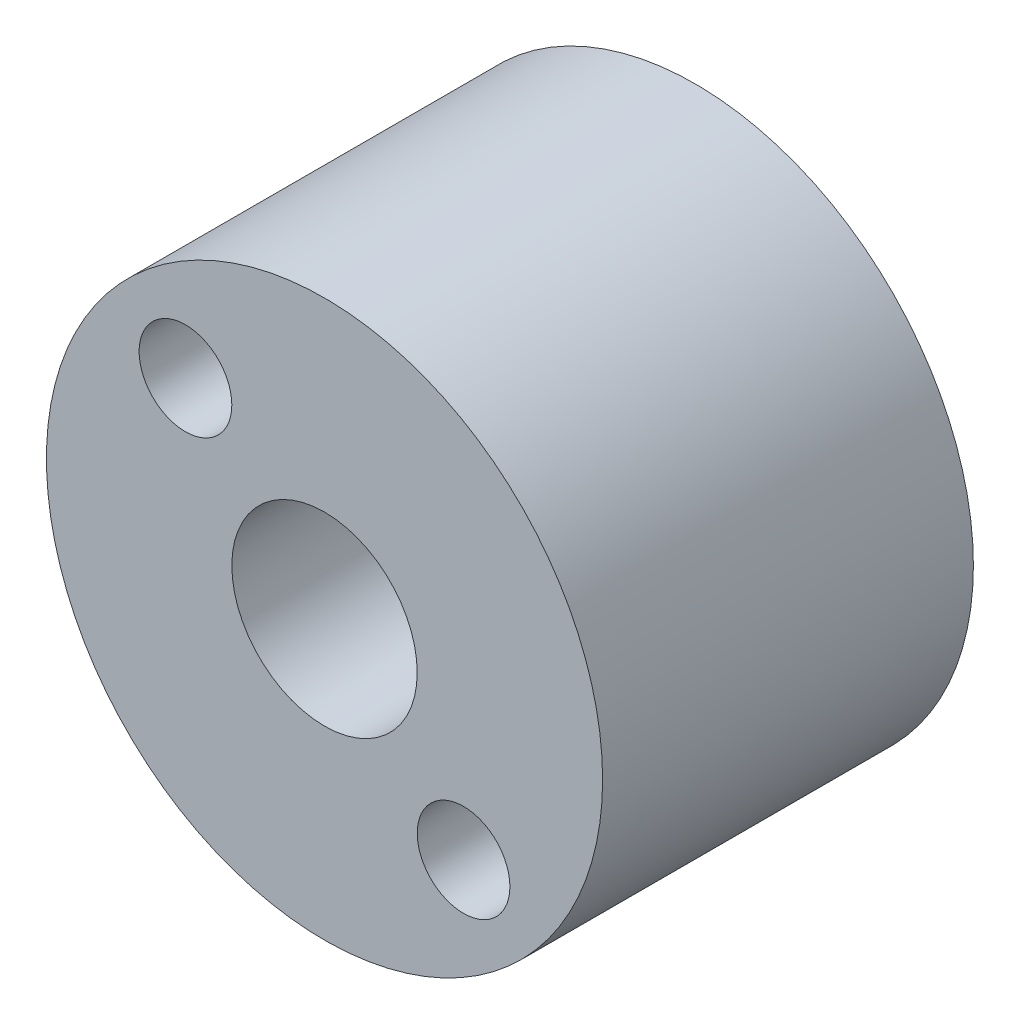
ISO-10303-21;
HEADER;
FILE_DESCRIPTION(('STEP AP214'),'2;1');
FILE_NAME('part.step','',(''),(''),'','','');
FILE_SCHEMA(('AUTOMOTIVE_DESIGN { 1 0 10303 214 1 1 1 1 }'));
ENDSEC;
DATA;
#1=APPLICATION_CONTEXT('core data for automotive mechanical design processes');
#2=APPLICATION_PROTOCOL_DEFINITION('international standard','automotive_design',2000,#1);
#3=PRODUCT_CONTEXT('',#1,'mechanical');
#4=PRODUCT('Part','Part','',(#3));
#5=PRODUCT_RELATED_PRODUCT_CATEGORY('part','',(#4));
#6=PRODUCT_DEFINITION_FORMATION('','',#4);
#7=PRODUCT_DEFINITION_CONTEXT('part definition',#1,'design');
#8=PRODUCT_DEFINITION('design','',#6,#7);
#9=PRODUCT_DEFINITION_SHAPE('','',#8);
#10=(LENGTH_UNIT() NAMED_UNIT(*) SI_UNIT(.MILLI.,.METRE.));
#11=(NAMED_UNIT(*) PLANE_ANGLE_UNIT() SI_UNIT($,.RADIAN.));
#12=(NAMED_UNIT(*) SI_UNIT($,.STERADIAN.) SOLID_ANGLE_UNIT());
#13=UNCERTAINTY_MEASURE_WITH_UNIT(LENGTH_MEASURE(1.E-05),#10,'distance_accuracy_value','');
#14=(GEOMETRIC_REPRESENTATION_CONTEXT(3) GLOBAL_UNCERTAINTY_ASSIGNED_CONTEXT((#13)) GLOBAL_UNIT_ASSIGNED_CONTEXT((#10,
#11,#12)) REPRESENTATION_CONTEXT('',''));
#15=CARTESIAN_POINT('',(0.,0.,0.));
#16=DIRECTION('',(0.,0.,1.));
#17=DIRECTION('',(1.,0.,0.));
#18=AXIS2_PLACEMENT_3D('',#15,#16,#17);
#19=CARTESIAN_POINT('',(0.,0.,20.));
#20=DIRECTION('',(0.,0.,-1.));
#21=DIRECTION('',(-1.,0.,0.));
#22=AXIS2_PLACEMENT_3D('',#19,#20,#21);
#23=CYLINDRICAL_SURFACE('',#22,15.);
#24=CARTESIAN_POINT('',(0.,0.,20.));
#25=DIRECTION('',(0.,0.,1.));
#26=DIRECTION('',(1.,0.,0.));
#27=AXIS2_PLACEMENT_3D('',#24,#25,#26);
#28=CIRCLE('',#27,15.);
#29=CARTESIAN_POINT('',(15.,0.,20.));
#30=VERTEX_POINT('',#29);
#31=EDGE_CURVE('E10',#30,#30,#28,.T.);
#32=ORIENTED_EDGE('',*,*,#31,.F.);
#33=EDGE_LOOP('',(#32));
#34=FACE_BOUND('',#33,.T.);
#35=CARTESIAN_POINT('',(0.,0.,0.));
#36=DIRECTION('',(0.,0.,1.));
#37=DIRECTION('',(1.,0.,0.));
#38=AXIS2_PLACEMENT_3D('',#35,#36,#37);
#39=CIRCLE('',#38,15.);
#40=CARTESIAN_POINT('',(15.,0.,0.));
#41=VERTEX_POINT('',#40);
#42=EDGE_CURVE('E34',#41,#41,#39,.T.);
#43=ORIENTED_EDGE('',*,*,#42,.T.);
#44=EDGE_LOOP('',(#43));
#45=FACE_BOUND('',#44,.T.);
#46=ADVANCED_FACE('F31',(#34,#45),#23,.T.);
#47=CARTESIAN_POINT('',(0.,0.,20.));
#48=DIRECTION('',(0.,0.,1.));
#49=DIRECTION('',(1.,0.,0.));
#50=AXIS2_PLACEMENT_3D('',#47,#48,#49);
#51=PLANE('',#50);
#52=CARTESIAN_POINT('',(-7.5,7.5,20.));
#53=DIRECTION('',(0.,0.,1.));
#54=DIRECTION('',(1.,0.,0.));
#55=AXIS2_PLACEMENT_3D('',#52,#53,#54);
#56=CIRCLE('',#55,2.5);
#57=CARTESIAN_POINT('',(-5.,7.5,20.));
#58=VERTEX_POINT('',#57);
#59=EDGE_CURVE('E57',#58,#58,#56,.T.);
#60=ORIENTED_EDGE('',*,*,#59,.F.);
#61=EDGE_LOOP('',(#60));
#62=FACE_BOUND('',#61,.T.);
#63=CARTESIAN_POINT('',(7.5,-7.5,20.));
#64=DIRECTION('',(0.,0.,1.));
#65=DIRECTION('',(1.,0.,0.));
#66=AXIS2_PLACEMENT_3D('',#63,#64,#65);
#67=CIRCLE('',#66,2.5);
#68=CARTESIAN_POINT('',(10.,-7.5,20.));
#69=VERTEX_POINT('',#68);
#70=EDGE_CURVE('E51',#69,#69,#67,.T.);
#71=ORIENTED_EDGE('',*,*,#70,.F.);
#72=EDGE_LOOP('',(#71));
#73=FACE_BOUND('',#72,.T.);
#74=CARTESIAN_POINT('',(0.,0.,20.));
#75=DIRECTION('',(0.,0.,1.));
#76=DIRECTION('',(1.,0.,0.));
#77=AXIS2_PLACEMENT_3D('',#74,#75,#76);
#78=CIRCLE('',#77,5.);
#79=CARTESIAN_POINT('',(5.,0.,20.));
#80=VERTEX_POINT('',#79);
#81=EDGE_CURVE('E45',#80,#80,#78,.T.);
#82=ORIENTED_EDGE('',*,*,#81,.F.);
#83=EDGE_LOOP('',(#82));
#84=FACE_BOUND('',#83,.T.);
#85=ORIENTED_EDGE('',*,*,#31,.T.);
#86=EDGE_LOOP('',(#85));
#87=FACE_BOUND('',#86,.T.);
#88=ADVANCED_FACE('F63',(#62,#73,#84,#87),#51,.T.);
#89=CARTESIAN_POINT('',(0.,0.,0.));
#90=DIRECTION('',(0.,0.,1.));
#91=DIRECTION('',(1.,0.,0.));
#92=AXIS2_PLACEMENT_3D('',#89,#90,#91);
#93=PLANE('',#92);
#94=CARTESIAN_POINT('',(-7.5,7.5,0.));
#95=DIRECTION('',(0.,0.,1.));
#96=DIRECTION('',(1.,0.,0.));
#97=AXIS2_PLACEMENT_3D('',#94,#95,#96);
#98=CIRCLE('',#97,2.49999999999999);
#99=CARTESIAN_POINT('',(-5.00000000000001,7.5,0.));
#100=VERTEX_POINT('',#99);
#101=EDGE_CURVE('E54',#100,#100,#98,.T.);
#102=ORIENTED_EDGE('',*,*,#101,.T.);
#103=EDGE_LOOP('',(#102));
#104=FACE_BOUND('',#103,.T.);
#105=CARTESIAN_POINT('',(7.5,-7.5,0.));
#106=DIRECTION('',(0.,0.,1.));
#107=DIRECTION('',(1.,0.,0.));
#108=AXIS2_PLACEMENT_3D('',#105,#106,#107);
#109=CIRCLE('',#108,2.49999999999999);
#110=CARTESIAN_POINT('',(9.99999999999999,-7.5,0.));
#111=VERTEX_POINT('',#110);
#112=EDGE_CURVE('E48',#111,#111,#109,.T.);
#113=ORIENTED_EDGE('',*,*,#112,.T.);
#114=EDGE_LOOP('',(#113));
#115=FACE_BOUND('',#114,.T.);
#116=CARTESIAN_POINT('',(0.,0.,0.));
#117=DIRECTION('',(0.,0.,1.));
#118=DIRECTION('',(1.,0.,0.));
#119=AXIS2_PLACEMENT_3D('',#116,#117,#118);
#120=CIRCLE('',#119,4.99999999999999);
#121=CARTESIAN_POINT('',(4.99999999999999,0.,0.));
#122=VERTEX_POINT('',#121);
#123=EDGE_CURVE('E41',#122,#122,#120,.T.);
#124=ORIENTED_EDGE('',*,*,#123,.T.);
#125=EDGE_LOOP('',(#124));
#126=FACE_BOUND('',#125,.T.);
#127=ORIENTED_EDGE('',*,*,#42,.F.);
#128=EDGE_LOOP('',(#127));
#129=FACE_BOUND('',#128,.T.);
#130=ADVANCED_FACE('F66',(#104,#115,#126,#129),#93,.F.);
#131=CARTESIAN_POINT('',(0.,0.,20.));
#132=DIRECTION('',(0.,0.,1.));
#133=DIRECTION('',(1.,0.,0.));
#134=AXIS2_PLACEMENT_3D('',#131,#132,#133);
#135=CYLINDRICAL_SURFACE('',#134,5.);
#136=ORIENTED_EDGE('',*,*,#123,.F.);
#137=EDGE_LOOP('',(#136));
#138=FACE_BOUND('',#137,.T.);
#139=ORIENTED_EDGE('',*,*,#81,.T.);
#140=EDGE_LOOP('',(#139));
#141=FACE_BOUND('',#140,.T.);
#142=ADVANCED_FACE('F72',(#138,#141),#135,.F.);
#143=CARTESIAN_POINT('',(7.5,-7.5,20.));
#144=DIRECTION('',(0.,0.,1.));
#145=DIRECTION('',(1.,0.,0.));
#146=AXIS2_PLACEMENT_3D('',#143,#144,#145);
#147=CYLINDRICAL_SURFACE('',#146,2.5);
#148=ORIENTED_EDGE('',*,*,#112,.F.);
#149=EDGE_LOOP('',(#148));
#150=FACE_BOUND('',#149,.T.);
#151=ORIENTED_EDGE('',*,*,#70,.T.);
#152=EDGE_LOOP('',(#151));
#153=FACE_BOUND('',#152,.T.);
#154=ADVANCED_FACE('F74',(#150,#153),#147,.F.);
#155=CARTESIAN_POINT('',(-7.5,7.5,20.));
#156=DIRECTION('',(0.,0.,1.));
#157=DIRECTION('',(1.,0.,0.));
#158=AXIS2_PLACEMENT_3D('',#155,#156,#157);
#159=CYLINDRICAL_SURFACE('',#158,2.5);
#160=ORIENTED_EDGE('',*,*,#101,.F.);
#161=EDGE_LOOP('',(#160));
#162=FACE_BOUND('',#161,.T.);
#163=ORIENTED_EDGE('',*,*,#59,.T.);
#164=EDGE_LOOP('',(#163));
#165=FACE_BOUND('',#164,.T.);
#166=ADVANCED_FACE('F61',(#162,#165),#159,.F.);
#167=CLOSED_SHELL('',(#46,#88,#130,#142,#154,#166));
#168=MANIFOLD_SOLID_BREP('B2',#167);
#169=ADVANCED_BREP_SHAPE_REPRESENTATION('',(#18,#168),#14);
#170=SHAPE_DEFINITION_REPRESENTATION(#9,#169);
ENDSEC;
END-ISO-10303-21;
